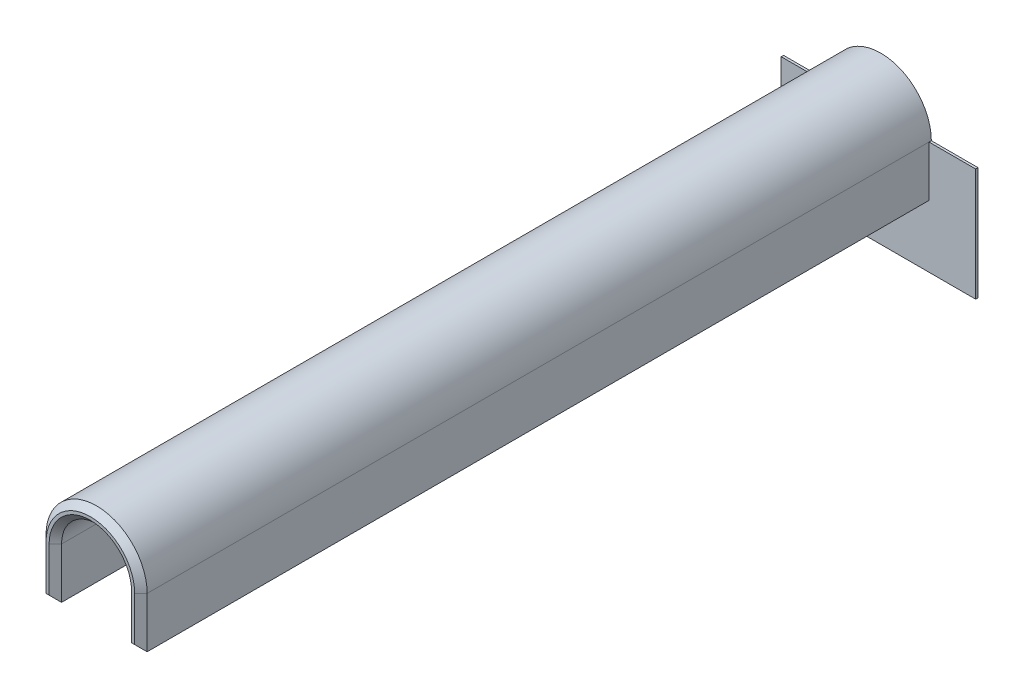
ISO-10303-21;
HEADER;
FILE_DESCRIPTION(('STEP AP214'),'2;1');
FILE_NAME('part.step','',(''),(''),'','','');
FILE_SCHEMA(('AUTOMOTIVE_DESIGN { 1 0 10303 214 1 1 1 1 }'));
ENDSEC;
DATA;
#1=APPLICATION_CONTEXT('core data for automotive mechanical design processes');
#2=APPLICATION_PROTOCOL_DEFINITION('international standard','automotive_design',2000,#1);
#3=PRODUCT_CONTEXT('',#1,'mechanical');
#4=PRODUCT('Part','Part','',(#3));
#5=PRODUCT_RELATED_PRODUCT_CATEGORY('part','',(#4));
#6=PRODUCT_DEFINITION_FORMATION('','',#4);
#7=PRODUCT_DEFINITION_CONTEXT('part definition',#1,'design');
#8=PRODUCT_DEFINITION('design','',#6,#7);
#9=PRODUCT_DEFINITION_SHAPE('','',#8);
#10=(LENGTH_UNIT() NAMED_UNIT(*) SI_UNIT(.MILLI.,.METRE.));
#11=(NAMED_UNIT(*) PLANE_ANGLE_UNIT() SI_UNIT($,.RADIAN.));
#12=(NAMED_UNIT(*) SI_UNIT($,.STERADIAN.) SOLID_ANGLE_UNIT());
#13=UNCERTAINTY_MEASURE_WITH_UNIT(LENGTH_MEASURE(1.E-05),#10,'distance_accuracy_value','');
#14=(GEOMETRIC_REPRESENTATION_CONTEXT(3) GLOBAL_UNCERTAINTY_ASSIGNED_CONTEXT((#13)) GLOBAL_UNIT_ASSIGNED_CONTEXT((#10,
#11,#12)) REPRESENTATION_CONTEXT('',''));
#15=CARTESIAN_POINT('',(0.,0.,0.));
#16=DIRECTION('',(0.,0.,1.));
#17=DIRECTION('',(1.,0.,0.));
#18=AXIS2_PLACEMENT_3D('',#15,#16,#17);
#19=CARTESIAN_POINT('',(4.5,-6.5,101.6));
#20=DIRECTION('',(0.,1.,0.));
#21=DIRECTION('',(0.,0.,1.));
#22=AXIS2_PLACEMENT_3D('',#19,#20,#21);
#23=PLANE('',#22);
#24=DIRECTION('',(0.,0.,-1.));
#25=VECTOR('',#24,1.);
#26=CARTESIAN_POINT('',(6.5,-6.5,101.6));
#27=LINE('',#26,#25);
#28=CARTESIAN_POINT('',(6.5,-6.5,100.8));
#29=VERTEX_POINT('',#28);
#30=CARTESIAN_POINT('',(6.5,-6.5,0.299999999999995));
#31=VERTEX_POINT('',#30);
#32=EDGE_CURVE('E229',#29,#31,#27,.T.);
#33=ORIENTED_EDGE('',*,*,#32,.F.);
#34=DIRECTION('',(-1.,0.,0.));
#35=VECTOR('',#34,1.);
#36=CARTESIAN_POINT('',(4.5,-6.5,100.8));
#37=LINE('',#36,#35);
#38=CARTESIAN_POINT('',(4.5,-6.5,100.8));
#39=VERTEX_POINT('',#38);
#40=EDGE_CURVE('E57',#29,#39,#37,.T.);
#41=ORIENTED_EDGE('',*,*,#40,.T.);
#42=DIRECTION('',(0.,0.,-1.));
#43=VECTOR('',#42,1.);
#44=CARTESIAN_POINT('',(4.5,-6.5,101.6));
#45=LINE('',#44,#43);
#46=CARTESIAN_POINT('',(4.5,-6.5,0.3));
#47=VERTEX_POINT('',#46);
#48=EDGE_CURVE('E231',#39,#47,#45,.T.);
#49=ORIENTED_EDGE('',*,*,#48,.T.);
#50=DIRECTION('',(-1.,0.,0.));
#51=VECTOR('',#50,1.);
#52=CARTESIAN_POINT('',(4.5,-6.5,0.299999999999995));
#53=LINE('',#52,#51);
#54=EDGE_CURVE('E194',#31,#47,#53,.T.);
#55=ORIENTED_EDGE('',*,*,#54,.F.);
#56=EDGE_LOOP('',(#33,#41,#49,#55));
#57=FACE_BOUND('',#56,.T.);
#58=ADVANCED_FACE('F33',(#57),#23,.F.);
#59=CARTESIAN_POINT('',(6.5,-6.5,101.6));
#60=DIRECTION('',(-1.,0.,0.));
#61=DIRECTION('',(0.,0.,1.));
#62=AXIS2_PLACEMENT_3D('',#59,#60,#61);
#63=PLANE('',#62);
#64=DIRECTION('',(0.,0.,-1.));
#65=VECTOR('',#64,1.);
#66=CARTESIAN_POINT('',(6.5,0.,101.6));
#67=LINE('',#66,#65);
#68=CARTESIAN_POINT('',(6.5,0.,100.8));
#69=VERTEX_POINT('',#68);
#70=CARTESIAN_POINT('',(6.5,0.,0.299999999999995));
#71=VERTEX_POINT('',#70);
#72=EDGE_CURVE('E227',#69,#71,#67,.T.);
#73=ORIENTED_EDGE('',*,*,#72,.F.);
#74=DIRECTION('',(0.,-1.,0.));
#75=VECTOR('',#74,1.);
#76=CARTESIAN_POINT('',(6.5,-6.5,100.8));
#77=LINE('',#76,#75);
#78=EDGE_CURVE('E259',#69,#29,#77,.T.);
#79=ORIENTED_EDGE('',*,*,#78,.T.);
#80=ORIENTED_EDGE('',*,*,#32,.T.);
#81=DIRECTION('',(0.,-1.,0.));
#82=VECTOR('',#81,1.);
#83=CARTESIAN_POINT('',(6.5,-6.5,0.299999999999995));
#84=LINE('',#83,#82);
#85=EDGE_CURVE('E203',#71,#31,#84,.T.);
#86=ORIENTED_EDGE('',*,*,#85,.F.);
#87=EDGE_LOOP('',(#73,#79,#80,#86));
#88=FACE_BOUND('',#87,.T.);
#89=ADVANCED_FACE('F366',(#88),#63,.F.);
#90=CARTESIAN_POINT('',(-6.5,-6.5,101.6));
#91=DIRECTION('',(1.,0.,0.));
#92=DIRECTION('',(0.,1.,0.));
#93=AXIS2_PLACEMENT_3D('',#90,#91,#92);
#94=PLANE('',#93);
#95=DIRECTION('',(0.,0.,-1.));
#96=VECTOR('',#95,1.);
#97=CARTESIAN_POINT('',(-6.5,-6.5,101.6));
#98=LINE('',#97,#96);
#99=CARTESIAN_POINT('',(-6.5,-6.5,100.8));
#100=VERTEX_POINT('',#99);
#101=CARTESIAN_POINT('',(-6.5,-6.5,0.299999999999995));
#102=VERTEX_POINT('',#101);
#103=EDGE_CURVE('E171',#100,#102,#98,.T.);
#104=ORIENTED_EDGE('',*,*,#103,.F.);
#105=DIRECTION('',(0.,1.,0.));
#106=VECTOR('',#105,1.);
#107=CARTESIAN_POINT('',(-6.5,-6.5,100.8));
#108=LINE('',#107,#106);
#109=CARTESIAN_POINT('',(-6.5,0.,100.8));
#110=VERTEX_POINT('',#109);
#111=EDGE_CURVE('E255',#100,#110,#108,.T.);
#112=ORIENTED_EDGE('',*,*,#111,.T.);
#113=DIRECTION('',(0.,0.,-1.));
#114=VECTOR('',#113,1.);
#115=CARTESIAN_POINT('',(-6.5,0.,101.6));
#116=LINE('',#115,#114);
#117=CARTESIAN_POINT('',(-6.5,0.,0.3));
#118=VERTEX_POINT('',#117);
#119=EDGE_CURVE('E225',#110,#118,#116,.T.);
#120=ORIENTED_EDGE('',*,*,#119,.T.);
#121=DIRECTION('',(0.,1.,0.));
#122=VECTOR('',#121,1.);
#123=CARTESIAN_POINT('',(-6.5,-6.5,0.299999999999995));
#124=LINE('',#123,#122);
#125=EDGE_CURVE('E200',#102,#118,#124,.T.);
#126=ORIENTED_EDGE('',*,*,#125,.F.);
#127=EDGE_LOOP('',(#104,#112,#120,#126));
#128=FACE_BOUND('',#127,.T.);
#129=ADVANCED_FACE('F389',(#128),#94,.F.);
#130=CARTESIAN_POINT('',(-4.5,-6.5,101.6));
#131=DIRECTION('',(0.,1.,0.));
#132=DIRECTION('',(-1.,0.,0.));
#133=AXIS2_PLACEMENT_3D('',#130,#131,#132);
#134=PLANE('',#133);
#135=DIRECTION('',(0.,0.,-1.));
#136=VECTOR('',#135,1.);
#137=CARTESIAN_POINT('',(-4.5,-6.5,101.6));
#138=LINE('',#137,#136);
#139=CARTESIAN_POINT('',(-4.5,-6.5,100.8));
#140=VERTEX_POINT('',#139);
#141=CARTESIAN_POINT('',(-4.5,-6.5,0.3));
#142=VERTEX_POINT('',#141);
#143=EDGE_CURVE('E160',#140,#142,#138,.T.);
#144=ORIENTED_EDGE('',*,*,#143,.F.);
#145=DIRECTION('',(-1.,0.,0.));
#146=VECTOR('',#145,1.);
#147=CARTESIAN_POINT('',(-4.5,-6.5,100.8));
#148=LINE('',#147,#146);
#149=EDGE_CURVE('E253',#140,#100,#148,.T.);
#150=ORIENTED_EDGE('',*,*,#149,.T.);
#151=ORIENTED_EDGE('',*,*,#103,.T.);
#152=DIRECTION('',(-1.,0.,0.));
#153=VECTOR('',#152,1.);
#154=CARTESIAN_POINT('',(-4.5,-6.5,0.299999999999995));
#155=LINE('',#154,#153);
#156=EDGE_CURVE('E191',#142,#102,#155,.T.);
#157=ORIENTED_EDGE('',*,*,#156,.F.);
#158=EDGE_LOOP('',(#144,#150,#151,#157));
#159=FACE_BOUND('',#158,.T.);
#160=ADVANCED_FACE('F198',(#159),#134,.F.);
#161=CARTESIAN_POINT('',(0.,0.,101.6));
#162=DIRECTION('',(0.,0.,-1.));
#163=DIRECTION('',(-1.,0.,0.));
#164=AXIS2_PLACEMENT_3D('',#161,#162,#163);
#165=CYLINDRICAL_SURFACE('',#164,4.5);
#166=DIRECTION('',(0.,0.,-1.));
#167=VECTOR('',#166,1.);
#168=CARTESIAN_POINT('',(4.5,0.,101.6));
#169=LINE('',#168,#167);
#170=CARTESIAN_POINT('',(4.5,0.,100.8));
#171=VERTEX_POINT('',#170);
#172=CARTESIAN_POINT('',(4.5,0.,0.));
#173=VERTEX_POINT('',#172);
#174=EDGE_CURVE('E233',#171,#173,#169,.T.);
#175=ORIENTED_EDGE('',*,*,#174,.F.);
#176=CARTESIAN_POINT('',(0.,0.,100.8));
#177=DIRECTION('',(0.,0.,-1.));
#178=DIRECTION('',(-1.,0.,0.));
#179=AXIS2_PLACEMENT_3D('',#176,#177,#178);
#180=CIRCLE('',#179,4.5);
#181=CARTESIAN_POINT('',(-4.5,0.,100.8));
#182=VERTEX_POINT('',#181);
#183=EDGE_CURVE('E11',#171,#182,#180,.F.);
#184=ORIENTED_EDGE('',*,*,#183,.T.);
#185=DIRECTION('',(0.,0.,-1.));
#186=VECTOR('',#185,1.);
#187=CARTESIAN_POINT('',(-4.5,0.,101.6));
#188=LINE('',#187,#186);
#189=CARTESIAN_POINT('',(-4.5,0.,0.));
#190=VERTEX_POINT('',#189);
#191=EDGE_CURVE('E172',#182,#190,#188,.T.);
#192=ORIENTED_EDGE('',*,*,#191,.T.);
#193=CARTESIAN_POINT('',(0.,0.,0.));
#194=DIRECTION('',(0.,0.,-1.));
#195=DIRECTION('',(-1.,0.,0.));
#196=AXIS2_PLACEMENT_3D('',#193,#194,#195);
#197=CIRCLE('',#196,4.5);
#198=EDGE_CURVE('E212',#190,#173,#197,.T.);
#199=ORIENTED_EDGE('',*,*,#198,.T.);
#200=EDGE_LOOP('',(#175,#184,#192,#199));
#201=FACE_BOUND('',#200,.T.);
#202=ADVANCED_FACE('F381',(#201),#165,.F.);
#203=CARTESIAN_POINT('',(4.5,0.,101.6));
#204=DIRECTION('',(1.,0.,0.));
#205=DIRECTION('',(0.,1.,0.));
#206=AXIS2_PLACEMENT_3D('',#203,#204,#205);
#207=PLANE('',#206);
#208=ORIENTED_EDGE('',*,*,#48,.F.);
#209=DIRECTION('',(0.,1.,0.));
#210=VECTOR('',#209,1.);
#211=CARTESIAN_POINT('',(4.5,0.,100.8));
#212=LINE('',#211,#210);
#213=EDGE_CURVE('E42',#39,#171,#212,.T.);
#214=ORIENTED_EDGE('',*,*,#213,.T.);
#215=ORIENTED_EDGE('',*,*,#174,.T.);
#216=DIRECTION('',(0.,-1.,0.));
#217=VECTOR('',#216,1.);
#218=CARTESIAN_POINT('',(4.5,0.,0.));
#219=LINE('',#218,#217);
#220=CARTESIAN_POINT('',(4.5,-6.5,0.));
#221=VERTEX_POINT('',#220);
#222=EDGE_CURVE('E215',#173,#221,#219,.T.);
#223=ORIENTED_EDGE('',*,*,#222,.T.);
#224=DIRECTION('',(0.,0.,-1.));
#225=VECTOR('',#224,1.);
#226=CARTESIAN_POINT('',(4.5,-6.5,0.3));
#227=LINE('',#226,#225);
#228=EDGE_CURVE('E182',#47,#221,#227,.T.);
#229=ORIENTED_EDGE('',*,*,#228,.F.);
#230=EDGE_LOOP('',(#208,#214,#215,#223,#229));
#231=FACE_BOUND('',#230,.T.);
#232=ADVANCED_FACE('F369',(#231),#207,.F.);
#233=CARTESIAN_POINT('',(0.,0.,101.6));
#234=DIRECTION('',(0.,0.,-1.));
#235=DIRECTION('',(-1.,0.,0.));
#236=AXIS2_PLACEMENT_3D('',#233,#234,#235);
#237=CYLINDRICAL_SURFACE('',#236,6.5);
#238=ORIENTED_EDGE('',*,*,#119,.F.);
#239=CARTESIAN_POINT('',(0.,0.,100.8));
#240=DIRECTION('',(0.,0.,-1.));
#241=DIRECTION('',(-1.,0.,0.));
#242=AXIS2_PLACEMENT_3D('',#239,#240,#241);
#243=CIRCLE('',#242,6.5);
#244=EDGE_CURVE('E257',#110,#69,#243,.T.);
#245=ORIENTED_EDGE('',*,*,#244,.T.);
#246=ORIENTED_EDGE('',*,*,#72,.T.);
#247=DIRECTION('',(0.,0.,-1.));
#248=VECTOR('',#247,1.);
#249=CARTESIAN_POINT('',(6.5,0.,101.6));
#250=LINE('',#249,#248);
#251=CARTESIAN_POINT('',(6.5,0.,0.));
#252=VERTEX_POINT('',#251);
#253=EDGE_CURVE('E206',#71,#252,#250,.T.);
#254=ORIENTED_EDGE('',*,*,#253,.T.);
#255=CARTESIAN_POINT('',(0.,0.,0.));
#256=DIRECTION('',(0.,0.,1.));
#257=DIRECTION('',(-1.,0.,0.));
#258=AXIS2_PLACEMENT_3D('',#255,#256,#257);
#259=CIRCLE('',#258,6.5);
#260=CARTESIAN_POINT('',(-6.5,0.,0.));
#261=VERTEX_POINT('',#260);
#262=EDGE_CURVE('E218',#252,#261,#259,.T.);
#263=ORIENTED_EDGE('',*,*,#262,.T.);
#264=DIRECTION('',(0.,0.,1.));
#265=VECTOR('',#264,1.);
#266=CARTESIAN_POINT('',(-6.5,0.,101.6));
#267=LINE('',#266,#265);
#268=EDGE_CURVE('E201',#261,#118,#267,.T.);
#269=ORIENTED_EDGE('',*,*,#268,.T.);
#270=EDGE_LOOP('',(#238,#245,#246,#254,#263,#269));
#271=FACE_BOUND('',#270,.T.);
#272=ADVANCED_FACE('F322',(#271),#237,.T.);
#273=CARTESIAN_POINT('',(-4.5,0.,101.6));
#274=DIRECTION('',(-1.,0.,0.));
#275=DIRECTION('',(0.,-1.,0.));
#276=AXIS2_PLACEMENT_3D('',#273,#274,#275);
#277=PLANE('',#276);
#278=ORIENTED_EDGE('',*,*,#191,.F.);
#279=DIRECTION('',(0.,-1.,0.));
#280=VECTOR('',#279,1.);
#281=CARTESIAN_POINT('',(-4.5,0.,100.8));
#282=LINE('',#281,#280);
#283=EDGE_CURVE('E168',#182,#140,#282,.T.);
#284=ORIENTED_EDGE('',*,*,#283,.T.);
#285=ORIENTED_EDGE('',*,*,#143,.T.);
#286=DIRECTION('',(0.,0.,-1.));
#287=VECTOR('',#286,1.);
#288=CARTESIAN_POINT('',(-4.5,-6.5,0.3));
#289=LINE('',#288,#287);
#290=CARTESIAN_POINT('',(-4.5,-6.5,0.));
#291=VERTEX_POINT('',#290);
#292=EDGE_CURVE('E165',#142,#291,#289,.T.);
#293=ORIENTED_EDGE('',*,*,#292,.T.);
#294=DIRECTION('',(0.,1.,0.));
#295=VECTOR('',#294,1.);
#296=CARTESIAN_POINT('',(-4.5,0.,0.));
#297=LINE('',#296,#295);
#298=EDGE_CURVE('E221',#291,#190,#297,.T.);
#299=ORIENTED_EDGE('',*,*,#298,.T.);
#300=EDGE_LOOP('',(#278,#284,#285,#293,#299));
#301=FACE_BOUND('',#300,.T.);
#302=ADVANCED_FACE('F163',(#301),#277,.F.);
#303=CARTESIAN_POINT('',(0.,0.,101.6));
#304=DIRECTION('',(0.,0.,-1.));
#305=DIRECTION('',(-1.,0.,0.));
#306=AXIS2_PLACEMENT_3D('',#303,#304,#305);
#307=PLANE('',#306);
#308=DIRECTION('',(1.,0.,0.));
#309=VECTOR('',#308,1.);
#310=CARTESIAN_POINT('',(0.,-5.70000000000003,101.6));
#311=LINE('',#310,#309);
#312=CARTESIAN_POINT('',(-5.70000000000003,-5.70000000000003,101.6));
#313=VERTEX_POINT('',#312);
#314=CARTESIAN_POINT('',(-5.29999999999997,-5.70000000000003,101.6));
#315=VERTEX_POINT('',#314);
#316=EDGE_CURVE('E247',#313,#315,#311,.T.);
#317=ORIENTED_EDGE('',*,*,#316,.T.);
#318=DIRECTION('',(0.,1.,0.));
#319=VECTOR('',#318,1.);
#320=CARTESIAN_POINT('',(-5.29999999999997,0.,101.6));
#321=LINE('',#320,#319);
#322=CARTESIAN_POINT('',(-5.29999999999997,0.,101.6));
#323=VERTEX_POINT('',#322);
#324=EDGE_CURVE('E249',#315,#323,#321,.T.);
#325=ORIENTED_EDGE('',*,*,#324,.T.);
#326=CARTESIAN_POINT('',(0.,0.,101.6));
#327=DIRECTION('',(0.,0.,-1.));
#328=DIRECTION('',(-1.,0.,0.));
#329=AXIS2_PLACEMENT_3D('',#326,#327,#328);
#330=CIRCLE('',#329,5.29999999999997);
#331=CARTESIAN_POINT('',(5.29999999999997,0.,101.6));
#332=VERTEX_POINT('',#331);
#333=EDGE_CURVE('E235',#323,#332,#330,.T.);
#334=ORIENTED_EDGE('',*,*,#333,.T.);
#335=DIRECTION('',(0.,-1.,0.));
#336=VECTOR('',#335,1.);
#337=CARTESIAN_POINT('',(5.29999999999997,0.,101.6));
#338=LINE('',#337,#336);
#339=CARTESIAN_POINT('',(5.29999999999997,-5.70000000000003,101.6));
#340=VERTEX_POINT('',#339);
#341=EDGE_CURVE('E237',#332,#340,#338,.T.);
#342=ORIENTED_EDGE('',*,*,#341,.T.);
#343=DIRECTION('',(1.,0.,0.));
#344=VECTOR('',#343,1.);
#345=CARTESIAN_POINT('',(0.,-5.70000000000003,101.6));
#346=LINE('',#345,#344);
#347=CARTESIAN_POINT('',(5.70000000000003,-5.70000000000003,101.6));
#348=VERTEX_POINT('',#347);
#349=EDGE_CURVE('E239',#340,#348,#346,.T.);
#350=ORIENTED_EDGE('',*,*,#349,.T.);
#351=DIRECTION('',(0.,1.,0.));
#352=VECTOR('',#351,1.);
#353=CARTESIAN_POINT('',(5.70000000000003,0.,101.6));
#354=LINE('',#353,#352);
#355=CARTESIAN_POINT('',(5.70000000000003,0.,101.6));
#356=VERTEX_POINT('',#355);
#357=EDGE_CURVE('E241',#348,#356,#354,.T.);
#358=ORIENTED_EDGE('',*,*,#357,.T.);
#359=CARTESIAN_POINT('',(0.,0.,101.6));
#360=DIRECTION('',(0.,0.,-1.));
#361=DIRECTION('',(-1.,0.,0.));
#362=AXIS2_PLACEMENT_3D('',#359,#360,#361);
#363=CIRCLE('',#362,5.70000000000003);
#364=CARTESIAN_POINT('',(-5.70000000000003,0.,101.6));
#365=VERTEX_POINT('',#364);
#366=EDGE_CURVE('E243',#356,#365,#363,.F.);
#367=ORIENTED_EDGE('',*,*,#366,.T.);
#368=DIRECTION('',(0.,-1.,0.));
#369=VECTOR('',#368,1.);
#370=CARTESIAN_POINT('',(-5.70000000000003,0.,101.6));
#371=LINE('',#370,#369);
#372=EDGE_CURVE('E245',#365,#313,#371,.T.);
#373=ORIENTED_EDGE('',*,*,#372,.T.);
#374=EDGE_LOOP('',(#317,#325,#334,#342,#350,#358,#367,#373));
#375=FACE_BOUND('',#374,.T.);
#376=ADVANCED_FACE('F360',(#375),#307,.F.);
#377=CARTESIAN_POINT('',(0.,0.,0.));
#378=DIRECTION('',(0.,0.,-1.));
#379=DIRECTION('',(-1.,0.,0.));
#380=AXIS2_PLACEMENT_3D('',#377,#378,#379);
#381=PLANE('',#380);
#382=ORIENTED_EDGE('',*,*,#262,.F.);
#383=DIRECTION('',(1.,0.,0.));
#384=VECTOR('',#383,1.);
#385=CARTESIAN_POINT('',(4.5,0.,0.));
#386=LINE('',#385,#384);
#387=CARTESIAN_POINT('',(12.5,0.,0.));
#388=VERTEX_POINT('',#387);
#389=EDGE_CURVE('E295',#252,#388,#386,.T.);
#390=ORIENTED_EDGE('',*,*,#389,.T.);
#391=DIRECTION('',(0.,-1.,0.));
#392=VECTOR('',#391,1.);
#393=CARTESIAN_POINT('',(12.5,0.,0.));
#394=LINE('',#393,#392);
#395=CARTESIAN_POINT('',(12.5,-14.5,0.));
#396=VERTEX_POINT('',#395);
#397=EDGE_CURVE('E301',#388,#396,#394,.T.);
#398=ORIENTED_EDGE('',*,*,#397,.T.);
#399=DIRECTION('',(-1.,0.,0.));
#400=VECTOR('',#399,1.);
#401=CARTESIAN_POINT('',(12.5,-14.5,0.));
#402=LINE('',#401,#400);
#403=CARTESIAN_POINT('',(-12.5,-14.5,0.));
#404=VERTEX_POINT('',#403);
#405=EDGE_CURVE('E304',#396,#404,#402,.T.);
#406=ORIENTED_EDGE('',*,*,#405,.T.);
#407=DIRECTION('',(0.,1.,0.));
#408=VECTOR('',#407,1.);
#409=CARTESIAN_POINT('',(-12.5,-14.5,0.));
#410=LINE('',#409,#408);
#411=CARTESIAN_POINT('',(-12.5,0.,0.));
#412=VERTEX_POINT('',#411);
#413=EDGE_CURVE('E307',#404,#412,#410,.T.);
#414=ORIENTED_EDGE('',*,*,#413,.T.);
#415=DIRECTION('',(1.,0.,0.));
#416=VECTOR('',#415,1.);
#417=CARTESIAN_POINT('',(-12.5,0.,0.));
#418=LINE('',#417,#416);
#419=EDGE_CURVE('E284',#412,#261,#418,.T.);
#420=ORIENTED_EDGE('',*,*,#419,.T.);
#421=EDGE_LOOP('',(#382,#390,#398,#406,#414,#420));
#422=FACE_BOUND('',#421,.T.);
#423=ORIENTED_EDGE('',*,*,#198,.F.);
#424=ORIENTED_EDGE('',*,*,#298,.F.);
#425=DIRECTION('',(1.,0.,0.));
#426=VECTOR('',#425,1.);
#427=CARTESIAN_POINT('',(-4.5,-6.5,0.));
#428=LINE('',#427,#426);
#429=EDGE_CURVE('E181',#291,#221,#428,.T.);
#430=ORIENTED_EDGE('',*,*,#429,.T.);
#431=ORIENTED_EDGE('',*,*,#222,.F.);
#432=EDGE_LOOP('',(#423,#424,#430,#431));
#433=FACE_BOUND('',#432,.T.);
#434=ADVANCED_FACE('F326',(#422,#433),#381,.T.);
#435=CARTESIAN_POINT('',(0.,0.,0.3));
#436=DIRECTION('',(0.,0.,-1.));
#437=DIRECTION('',(-1.,0.,0.));
#438=AXIS2_PLACEMENT_3D('',#435,#436,#437);
#439=PLANE('',#438);
#440=ORIENTED_EDGE('',*,*,#85,.T.);
#441=ORIENTED_EDGE('',*,*,#54,.T.);
#442=DIRECTION('',(1.,0.,0.));
#443=VECTOR('',#442,1.);
#444=CARTESIAN_POINT('',(-4.5,-6.5,0.3));
#445=LINE('',#444,#443);
#446=EDGE_CURVE('E178',#142,#47,#445,.T.);
#447=ORIENTED_EDGE('',*,*,#446,.F.);
#448=ORIENTED_EDGE('',*,*,#156,.T.);
#449=ORIENTED_EDGE('',*,*,#125,.T.);
#450=DIRECTION('',(1.,0.,0.));
#451=VECTOR('',#450,1.);
#452=CARTESIAN_POINT('',(-12.5,0.,0.3));
#453=LINE('',#452,#451);
#454=CARTESIAN_POINT('',(-12.5,0.,0.3));
#455=VERTEX_POINT('',#454);
#456=EDGE_CURVE('E196',#455,#118,#453,.T.);
#457=ORIENTED_EDGE('',*,*,#456,.F.);
#458=DIRECTION('',(0.,1.,0.));
#459=VECTOR('',#458,1.);
#460=CARTESIAN_POINT('',(-12.5,-14.5,0.3));
#461=LINE('',#460,#459);
#462=CARTESIAN_POINT('',(-12.5,-14.5,0.3));
#463=VERTEX_POINT('',#462);
#464=EDGE_CURVE('E183',#463,#455,#461,.T.);
#465=ORIENTED_EDGE('',*,*,#464,.F.);
#466=DIRECTION('',(-1.,0.,0.));
#467=VECTOR('',#466,1.);
#468=CARTESIAN_POINT('',(12.5,-14.5,0.3));
#469=LINE('',#468,#467);
#470=CARTESIAN_POINT('',(12.5,-14.5,0.3));
#471=VERTEX_POINT('',#470);
#472=EDGE_CURVE('E393',#471,#463,#469,.T.);
#473=ORIENTED_EDGE('',*,*,#472,.F.);
#474=DIRECTION('',(0.,-1.,0.));
#475=VECTOR('',#474,1.);
#476=CARTESIAN_POINT('',(12.5,0.,0.3));
#477=LINE('',#476,#475);
#478=CARTESIAN_POINT('',(12.5,0.,0.3));
#479=VERTEX_POINT('',#478);
#480=EDGE_CURVE('E336',#479,#471,#477,.T.);
#481=ORIENTED_EDGE('',*,*,#480,.F.);
#482=DIRECTION('',(1.,0.,0.));
#483=VECTOR('',#482,1.);
#484=CARTESIAN_POINT('',(4.5,0.,0.3));
#485=LINE('',#484,#483);
#486=EDGE_CURVE('E195',#71,#479,#485,.T.);
#487=ORIENTED_EDGE('',*,*,#486,.F.);
#488=EDGE_LOOP('',(#440,#441,#447,#448,#449,#457,#465,#473,#481,#487));
#489=FACE_BOUND('',#488,.T.);
#490=ADVANCED_FACE('F189',(#489),#439,.F.);
#491=CARTESIAN_POINT('',(-12.5,0.,0.3));
#492=DIRECTION('',(0.,1.,0.));
#493=DIRECTION('',(-1.,0.,0.));
#494=AXIS2_PLACEMENT_3D('',#491,#492,#493);
#495=PLANE('',#494);
#496=ORIENTED_EDGE('',*,*,#268,.F.);
#497=ORIENTED_EDGE('',*,*,#419,.F.);
#498=DIRECTION('',(0.,0.,-1.));
#499=VECTOR('',#498,1.);
#500=CARTESIAN_POINT('',(-12.5,0.,0.3));
#501=LINE('',#500,#499);
#502=EDGE_CURVE('E309',#455,#412,#501,.T.);
#503=ORIENTED_EDGE('',*,*,#502,.F.);
#504=ORIENTED_EDGE('',*,*,#456,.T.);
#505=EDGE_LOOP('',(#496,#497,#503,#504));
#506=FACE_BOUND('',#505,.T.);
#507=ADVANCED_FACE('F349',(#506),#495,.T.);
#508=CARTESIAN_POINT('',(4.5,0.,0.3));
#509=DIRECTION('',(0.,1.,0.));
#510=DIRECTION('',(-1.,0.,0.));
#511=AXIS2_PLACEMENT_3D('',#508,#509,#510);
#512=PLANE('',#511);
#513=ORIENTED_EDGE('',*,*,#253,.F.);
#514=ORIENTED_EDGE('',*,*,#486,.T.);
#515=DIRECTION('',(0.,0.,-1.));
#516=VECTOR('',#515,1.);
#517=CARTESIAN_POINT('',(12.5,0.,0.3));
#518=LINE('',#517,#516);
#519=EDGE_CURVE('E315',#479,#388,#518,.T.);
#520=ORIENTED_EDGE('',*,*,#519,.T.);
#521=ORIENTED_EDGE('',*,*,#389,.F.);
#522=EDGE_LOOP('',(#513,#514,#520,#521));
#523=FACE_BOUND('',#522,.T.);
#524=ADVANCED_FACE('F330',(#523),#512,.T.);
#525=CARTESIAN_POINT('',(-12.5,-14.5,0.3));
#526=DIRECTION('',(-1.,0.,0.));
#527=DIRECTION('',(0.,0.,1.));
#528=AXIS2_PLACEMENT_3D('',#525,#526,#527);
#529=PLANE('',#528);
#530=ORIENTED_EDGE('',*,*,#413,.F.);
#531=DIRECTION('',(0.,0.,-1.));
#532=VECTOR('',#531,1.);
#533=CARTESIAN_POINT('',(-12.5,-14.5,0.3));
#534=LINE('',#533,#532);
#535=EDGE_CURVE('E311',#463,#404,#534,.T.);
#536=ORIENTED_EDGE('',*,*,#535,.F.);
#537=ORIENTED_EDGE('',*,*,#464,.T.);
#538=ORIENTED_EDGE('',*,*,#502,.T.);
#539=EDGE_LOOP('',(#530,#536,#537,#538));
#540=FACE_BOUND('',#539,.T.);
#541=ADVANCED_FACE('F343',(#540),#529,.T.);
#542=CARTESIAN_POINT('',(12.5,-14.5,0.3));
#543=DIRECTION('',(0.,-1.,0.));
#544=DIRECTION('',(0.,0.,-1.));
#545=AXIS2_PLACEMENT_3D('',#542,#543,#544);
#546=PLANE('',#545);
#547=ORIENTED_EDGE('',*,*,#405,.F.);
#548=DIRECTION('',(0.,0.,-1.));
#549=VECTOR('',#548,1.);
#550=CARTESIAN_POINT('',(12.5,-14.5,0.3));
#551=LINE('',#550,#549);
#552=EDGE_CURVE('E313',#471,#396,#551,.T.);
#553=ORIENTED_EDGE('',*,*,#552,.F.);
#554=ORIENTED_EDGE('',*,*,#472,.T.);
#555=ORIENTED_EDGE('',*,*,#535,.T.);
#556=EDGE_LOOP('',(#547,#553,#554,#555));
#557=FACE_BOUND('',#556,.T.);
#558=ADVANCED_FACE('F340',(#557),#546,.T.);
#559=CARTESIAN_POINT('',(12.5,0.,0.3));
#560=DIRECTION('',(1.,0.,0.));
#561=DIRECTION('',(0.,1.,0.));
#562=AXIS2_PLACEMENT_3D('',#559,#560,#561);
#563=PLANE('',#562);
#564=ORIENTED_EDGE('',*,*,#397,.F.);
#565=ORIENTED_EDGE('',*,*,#519,.F.);
#566=ORIENTED_EDGE('',*,*,#480,.T.);
#567=ORIENTED_EDGE('',*,*,#552,.T.);
#568=EDGE_LOOP('',(#564,#565,#566,#567));
#569=FACE_BOUND('',#568,.T.);
#570=ADVANCED_FACE('F334',(#569),#563,.T.);
#571=CARTESIAN_POINT('',(-4.5,-6.5,0.3));
#572=DIRECTION('',(0.,1.,0.));
#573=DIRECTION('',(-1.,0.,0.));
#574=AXIS2_PLACEMENT_3D('',#571,#572,#573);
#575=PLANE('',#574);
#576=ORIENTED_EDGE('',*,*,#429,.F.);
#577=ORIENTED_EDGE('',*,*,#292,.F.);
#578=ORIENTED_EDGE('',*,*,#446,.T.);
#579=ORIENTED_EDGE('',*,*,#228,.T.);
#580=EDGE_LOOP('',(#576,#577,#578,#579));
#581=FACE_BOUND('',#580,.T.);
#582=ADVANCED_FACE('F177',(#581),#575,.T.);
#583=CARTESIAN_POINT('',(5.70000000000003,0.,101.6));
#584=DIRECTION('',(-0.707106781186551,0.,-0.707106781186544));
#585=DIRECTION('',(0.,1.,0.));
#586=AXIS2_PLACEMENT_3D('',#583,#584,#585);
#587=PLANE('',#586);
#588=DIRECTION('',(-0.577350269189624,0.577350269189624,0.57735026918963));
#589=VECTOR('',#588,1.);
#590=CARTESIAN_POINT('',(3.80000000000003,-3.80000000000003,103.5));
#591=LINE('',#590,#589);
#592=EDGE_CURVE('E278',#29,#348,#591,.T.);
#593=ORIENTED_EDGE('',*,*,#592,.F.);
#594=ORIENTED_EDGE('',*,*,#78,.F.);
#595=DIRECTION('',(0.707106781186544,0.,-0.707106781186551));
#596=VECTOR('',#595,1.);
#597=CARTESIAN_POINT('',(5.70000000000003,0.,101.6));
#598=LINE('',#597,#596);
#599=EDGE_CURVE('E37',#356,#69,#598,.T.);
#600=ORIENTED_EDGE('',*,*,#599,.F.);
#601=ORIENTED_EDGE('',*,*,#357,.F.);
#602=EDGE_LOOP('',(#593,#594,#600,#601));
#603=FACE_BOUND('',#602,.T.);
#604=ADVANCED_FACE('F35',(#603),#587,.F.);
#605=CARTESIAN_POINT('',(0.,0.,101.6));
#606=DIRECTION('',(0.,0.,-1.));
#607=DIRECTION('',(-1.,0.,0.));
#608=AXIS2_PLACEMENT_3D('',#605,#606,#607);
#609=CONICAL_SURFACE('',#608,5.70000000000003,0.785398163397443);
#610=ORIENTED_EDGE('',*,*,#599,.T.);
#611=ORIENTED_EDGE('',*,*,#244,.F.);
#612=DIRECTION('',(-0.707106781186544,0.,-0.707106781186551));
#613=VECTOR('',#612,1.);
#614=CARTESIAN_POINT('',(-5.70000000000003,0.,101.6));
#615=LINE('',#614,#613);
#616=EDGE_CURVE('E276',#365,#110,#615,.T.);
#617=ORIENTED_EDGE('',*,*,#616,.F.);
#618=ORIENTED_EDGE('',*,*,#366,.F.);
#619=EDGE_LOOP('',(#610,#611,#617,#618));
#620=FACE_BOUND('',#619,.T.);
#621=ADVANCED_FACE('F352',(#620),#609,.T.);
#622=CARTESIAN_POINT('',(0.,-5.70000000000003,101.6));
#623=DIRECTION('',(0.,0.707106781186551,-0.707106781186544));
#624=DIRECTION('',(1.,0.,0.));
#625=AXIS2_PLACEMENT_3D('',#622,#623,#624);
#626=PLANE('',#625);
#627=ORIENTED_EDGE('',*,*,#592,.T.);
#628=ORIENTED_EDGE('',*,*,#349,.F.);
#629=DIRECTION('',(0.577350269189624,0.577350269189624,0.57735026918963));
#630=VECTOR('',#629,1.);
#631=CARTESIAN_POINT('',(7.19999999999997,-3.80000000000003,103.5));
#632=LINE('',#631,#630);
#633=EDGE_CURVE('E273',#39,#340,#632,.T.);
#634=ORIENTED_EDGE('',*,*,#633,.F.);
#635=ORIENTED_EDGE('',*,*,#40,.F.);
#636=EDGE_LOOP('',(#627,#628,#634,#635));
#637=FACE_BOUND('',#636,.T.);
#638=ADVANCED_FACE('F370',(#637),#626,.F.);
#639=CARTESIAN_POINT('',(-5.70000000000003,0.,101.6));
#640=DIRECTION('',(0.707106781186551,0.,-0.707106781186544));
#641=DIRECTION('',(0.,-1.,0.));
#642=AXIS2_PLACEMENT_3D('',#639,#640,#641);
#643=PLANE('',#642);
#644=ORIENTED_EDGE('',*,*,#616,.T.);
#645=ORIENTED_EDGE('',*,*,#111,.F.);
#646=DIRECTION('',(0.577350269189624,0.577350269189624,0.57735026918963));
#647=VECTOR('',#646,1.);
#648=CARTESIAN_POINT('',(-3.80000000000003,-3.80000000000003,103.5));
#649=LINE('',#648,#647);
#650=EDGE_CURVE('E270',#313,#100,#649,.F.);
#651=ORIENTED_EDGE('',*,*,#650,.F.);
#652=ORIENTED_EDGE('',*,*,#372,.F.);
#653=EDGE_LOOP('',(#644,#645,#651,#652));
#654=FACE_BOUND('',#653,.T.);
#655=ADVANCED_FACE('F356',(#654),#643,.F.);
#656=CARTESIAN_POINT('',(5.29999999999997,0.,101.6));
#657=DIRECTION('',(0.707106781186551,0.,-0.707106781186544));
#658=DIRECTION('',(0.,-1.,0.));
#659=AXIS2_PLACEMENT_3D('',#656,#657,#658);
#660=PLANE('',#659);
#661=ORIENTED_EDGE('',*,*,#633,.T.);
#662=ORIENTED_EDGE('',*,*,#341,.F.);
#663=DIRECTION('',(0.707106781186544,0.,0.707106781186551));
#664=VECTOR('',#663,1.);
#665=CARTESIAN_POINT('',(4.5,0.,100.8));
#666=LINE('',#665,#664);
#667=EDGE_CURVE('E267',#171,#332,#666,.T.);
#668=ORIENTED_EDGE('',*,*,#667,.F.);
#669=ORIENTED_EDGE('',*,*,#213,.F.);
#670=EDGE_LOOP('',(#661,#662,#668,#669));
#671=FACE_BOUND('',#670,.T.);
#672=ADVANCED_FACE('F374',(#671),#660,.F.);
#673=CARTESIAN_POINT('',(0.,-5.70000000000003,101.6));
#674=DIRECTION('',(0.,0.707106781186551,-0.707106781186544));
#675=DIRECTION('',(1.,0.,0.));
#676=AXIS2_PLACEMENT_3D('',#673,#674,#675);
#677=PLANE('',#676);
#678=ORIENTED_EDGE('',*,*,#650,.T.);
#679=ORIENTED_EDGE('',*,*,#149,.F.);
#680=DIRECTION('',(-0.577350269189623,0.577350269189624,0.57735026918963));
#681=VECTOR('',#680,1.);
#682=CARTESIAN_POINT('',(-3.53333333333333,-7.46666666666667,99.8333333333333));
#683=LINE('',#682,#681);
#684=EDGE_CURVE('E265',#315,#140,#683,.F.);
#685=ORIENTED_EDGE('',*,*,#684,.F.);
#686=ORIENTED_EDGE('',*,*,#316,.F.);
#687=EDGE_LOOP('',(#678,#679,#685,#686));
#688=FACE_BOUND('',#687,.T.);
#689=ADVANCED_FACE('F388',(#688),#677,.F.);
#690=CARTESIAN_POINT('',(0.,0.,101.6));
#691=DIRECTION('',(0.,0.,1.));
#692=DIRECTION('',(1.,0.,0.));
#693=AXIS2_PLACEMENT_3D('',#690,#691,#692);
#694=CONICAL_SURFACE('',#693,5.29999999999997,0.785398163397443);
#695=ORIENTED_EDGE('',*,*,#667,.T.);
#696=ORIENTED_EDGE('',*,*,#333,.F.);
#697=DIRECTION('',(-0.707106781186544,0.,0.707106781186551));
#698=VECTOR('',#697,1.);
#699=CARTESIAN_POINT('',(-4.5,0.,100.8));
#700=LINE('',#699,#698);
#701=EDGE_CURVE('E263',#182,#323,#700,.T.);
#702=ORIENTED_EDGE('',*,*,#701,.F.);
#703=ORIENTED_EDGE('',*,*,#183,.F.);
#704=EDGE_LOOP('',(#695,#696,#702,#703));
#705=FACE_BOUND('',#704,.T.);
#706=ADVANCED_FACE('F379',(#705),#694,.F.);
#707=CARTESIAN_POINT('',(-5.29999999999997,0.,101.6));
#708=DIRECTION('',(-0.707106781186551,0.,-0.707106781186544));
#709=DIRECTION('',(0.,1.,0.));
#710=AXIS2_PLACEMENT_3D('',#707,#708,#709);
#711=PLANE('',#710);
#712=ORIENTED_EDGE('',*,*,#684,.T.);
#713=ORIENTED_EDGE('',*,*,#283,.F.);
#714=ORIENTED_EDGE('',*,*,#701,.T.);
#715=ORIENTED_EDGE('',*,*,#324,.F.);
#716=EDGE_LOOP('',(#712,#713,#714,#715));
#717=FACE_BOUND('',#716,.T.);
#718=ADVANCED_FACE('F384',(#717),#711,.F.);
#719=CLOSED_SHELL('',(#58,#89,#129,#160,#202,#232,#272,#302,#376,#434,#490,#507,#524,#541,#558,
#570,#582,#604,#621,#638,#655,#672,#689,#706,#718));
#720=MANIFOLD_SOLID_BREP('B2',#719);
#721=ADVANCED_BREP_SHAPE_REPRESENTATION('',(#18,#720),#14);
#722=SHAPE_DEFINITION_REPRESENTATION(#9,#721);
ENDSEC;
END-ISO-10303-21;
